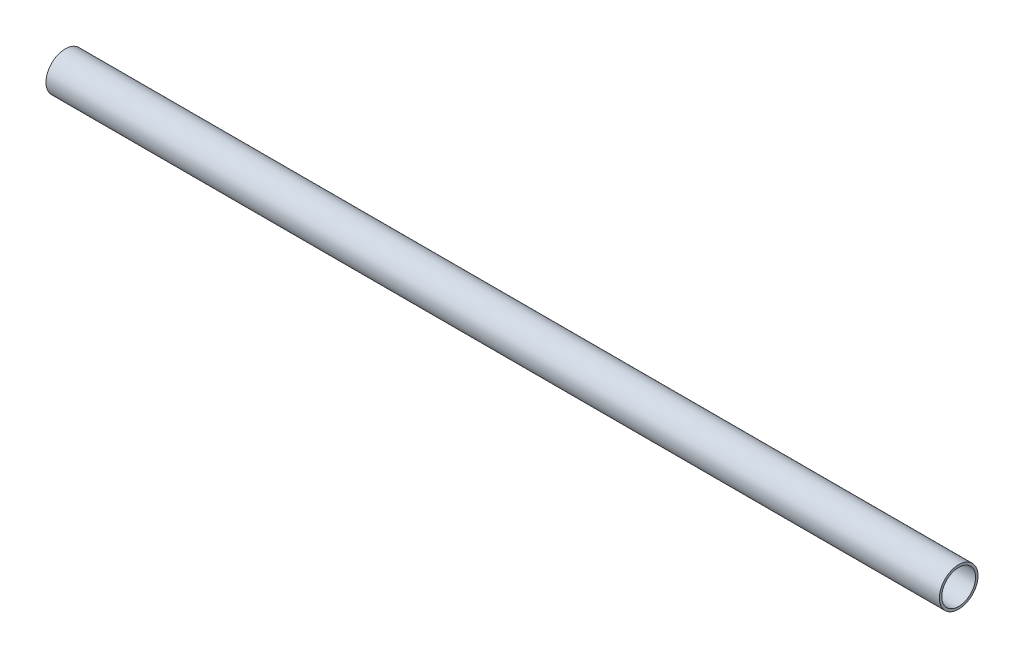
ISO-10303-21;
HEADER;
FILE_DESCRIPTION(('STEP AP214'),'2;1');
FILE_NAME('part.step','',(''),(''),'','','');
FILE_SCHEMA(('AUTOMOTIVE_DESIGN { 1 0 10303 214 1 1 1 1 }'));
ENDSEC;
DATA;
#1=APPLICATION_CONTEXT('core data for automotive mechanical design processes');
#2=APPLICATION_PROTOCOL_DEFINITION('international standard','automotive_design',2000,#1);
#3=PRODUCT_CONTEXT('',#1,'mechanical');
#4=PRODUCT('Part','Part','',(#3));
#5=PRODUCT_RELATED_PRODUCT_CATEGORY('part','',(#4));
#6=PRODUCT_DEFINITION_FORMATION('','',#4);
#7=PRODUCT_DEFINITION_CONTEXT('part definition',#1,'design');
#8=PRODUCT_DEFINITION('design','',#6,#7);
#9=PRODUCT_DEFINITION_SHAPE('','',#8);
#10=(LENGTH_UNIT() NAMED_UNIT(*) SI_UNIT(.MILLI.,.METRE.));
#11=(NAMED_UNIT(*) PLANE_ANGLE_UNIT() SI_UNIT($,.RADIAN.));
#12=(NAMED_UNIT(*) SI_UNIT($,.STERADIAN.) SOLID_ANGLE_UNIT());
#13=UNCERTAINTY_MEASURE_WITH_UNIT(LENGTH_MEASURE(1.E-05),#10,'distance_accuracy_value','');
#14=(GEOMETRIC_REPRESENTATION_CONTEXT(3) GLOBAL_UNCERTAINTY_ASSIGNED_CONTEXT((#13)) GLOBAL_UNIT_ASSIGNED_CONTEXT((#10,
#11,#12)) REPRESENTATION_CONTEXT('',''));
#15=CARTESIAN_POINT('',(0.,0.,0.));
#16=DIRECTION('',(0.,0.,1.));
#17=DIRECTION('',(1.,0.,0.));
#18=AXIS2_PLACEMENT_3D('',#15,#16,#17);
#19=CARTESIAN_POINT('',(185.,0.,0.));
#20=DIRECTION('',(1.,0.,0.));
#21=DIRECTION('',(0.,0.,-1.));
#22=AXIS2_PLACEMENT_3D('',#19,#20,#21);
#23=PLANE('',#22);
#24=CARTESIAN_POINT('',(185.,0.,0.));
#25=DIRECTION('',(1.,0.,0.));
#26=DIRECTION('',(0.,0.,-1.));
#27=AXIS2_PLACEMENT_3D('',#24,#25,#26);
#28=CIRCLE('',#27,8.);
#29=CARTESIAN_POINT('',(185.,0.,-8.));
#30=VERTEX_POINT('',#29);
#31=EDGE_CURVE('E10',#30,#30,#28,.T.);
#32=ORIENTED_EDGE('',*,*,#31,.T.);
#33=EDGE_LOOP('',(#32));
#34=FACE_BOUND('',#33,.T.);
#35=CARTESIAN_POINT('',(185.,0.,0.));
#36=DIRECTION('',(1.,0.,0.));
#37=DIRECTION('',(0.,0.,-1.));
#38=AXIS2_PLACEMENT_3D('',#35,#36,#37);
#39=CIRCLE('',#38,7.);
#40=CARTESIAN_POINT('',(185.,0.,-7.));
#41=VERTEX_POINT('',#40);
#42=EDGE_CURVE('E44',#41,#41,#39,.T.);
#43=ORIENTED_EDGE('',*,*,#42,.F.);
#44=EDGE_LOOP('',(#43));
#45=FACE_BOUND('',#44,.T.);
#46=ADVANCED_FACE('F33',(#34,#45),#23,.T.);
#47=CARTESIAN_POINT('',(-185.,0.,0.));
#48=DIRECTION('',(1.,0.,0.));
#49=DIRECTION('',(0.,0.,-1.));
#50=AXIS2_PLACEMENT_3D('',#47,#48,#49);
#51=PLANE('',#50);
#52=CARTESIAN_POINT('',(-185.,0.,0.));
#53=DIRECTION('',(1.,0.,0.));
#54=DIRECTION('',(0.,0.,-1.));
#55=AXIS2_PLACEMENT_3D('',#52,#53,#54);
#56=CIRCLE('',#55,8.);
#57=CARTESIAN_POINT('',(-185.,0.,-8.));
#58=VERTEX_POINT('',#57);
#59=EDGE_CURVE('E37',#58,#58,#56,.T.);
#60=ORIENTED_EDGE('',*,*,#59,.F.);
#61=EDGE_LOOP('',(#60));
#62=FACE_BOUND('',#61,.T.);
#63=CARTESIAN_POINT('',(-185.,0.,0.));
#64=DIRECTION('',(1.,0.,0.));
#65=DIRECTION('',(0.,0.,-1.));
#66=AXIS2_PLACEMENT_3D('',#63,#64,#65);
#67=CIRCLE('',#66,7.);
#68=CARTESIAN_POINT('',(-185.,0.,-7.));
#69=VERTEX_POINT('',#68);
#70=EDGE_CURVE('E46',#69,#69,#67,.T.);
#71=ORIENTED_EDGE('',*,*,#70,.T.);
#72=EDGE_LOOP('',(#71));
#73=FACE_BOUND('',#72,.T.);
#74=ADVANCED_FACE('F56',(#62,#73),#51,.F.);
#75=CARTESIAN_POINT('',(185.,0.,0.));
#76=DIRECTION('',(-1.,0.,0.));
#77=DIRECTION('',(0.,0.,1.));
#78=AXIS2_PLACEMENT_3D('',#75,#76,#77);
#79=CYLINDRICAL_SURFACE('',#78,8.);
#80=ORIENTED_EDGE('',*,*,#31,.F.);
#81=EDGE_LOOP('',(#80));
#82=FACE_BOUND('',#81,.T.);
#83=ORIENTED_EDGE('',*,*,#59,.T.);
#84=EDGE_LOOP('',(#83));
#85=FACE_BOUND('',#84,.T.);
#86=ADVANCED_FACE('F35',(#82,#85),#79,.T.);
#87=CARTESIAN_POINT('',(185.,0.,0.));
#88=DIRECTION('',(-1.,0.,0.));
#89=DIRECTION('',(0.,0.,1.));
#90=AXIS2_PLACEMENT_3D('',#87,#88,#89);
#91=CYLINDRICAL_SURFACE('',#90,7.);
#92=ORIENTED_EDGE('',*,*,#42,.T.);
#93=EDGE_LOOP('',(#92));
#94=FACE_BOUND('',#93,.T.);
#95=ORIENTED_EDGE('',*,*,#70,.F.);
#96=EDGE_LOOP('',(#95));
#97=FACE_BOUND('',#96,.T.);
#98=ADVANCED_FACE('F52',(#94,#97),#91,.F.);
#99=CLOSED_SHELL('',(#46,#74,#86,#98));
#100=MANIFOLD_SOLID_BREP('B2',#99);
#101=ADVANCED_BREP_SHAPE_REPRESENTATION('',(#18,#100),#14);
#102=SHAPE_DEFINITION_REPRESENTATION(#9,#101);
ENDSEC;
END-ISO-10303-21;
